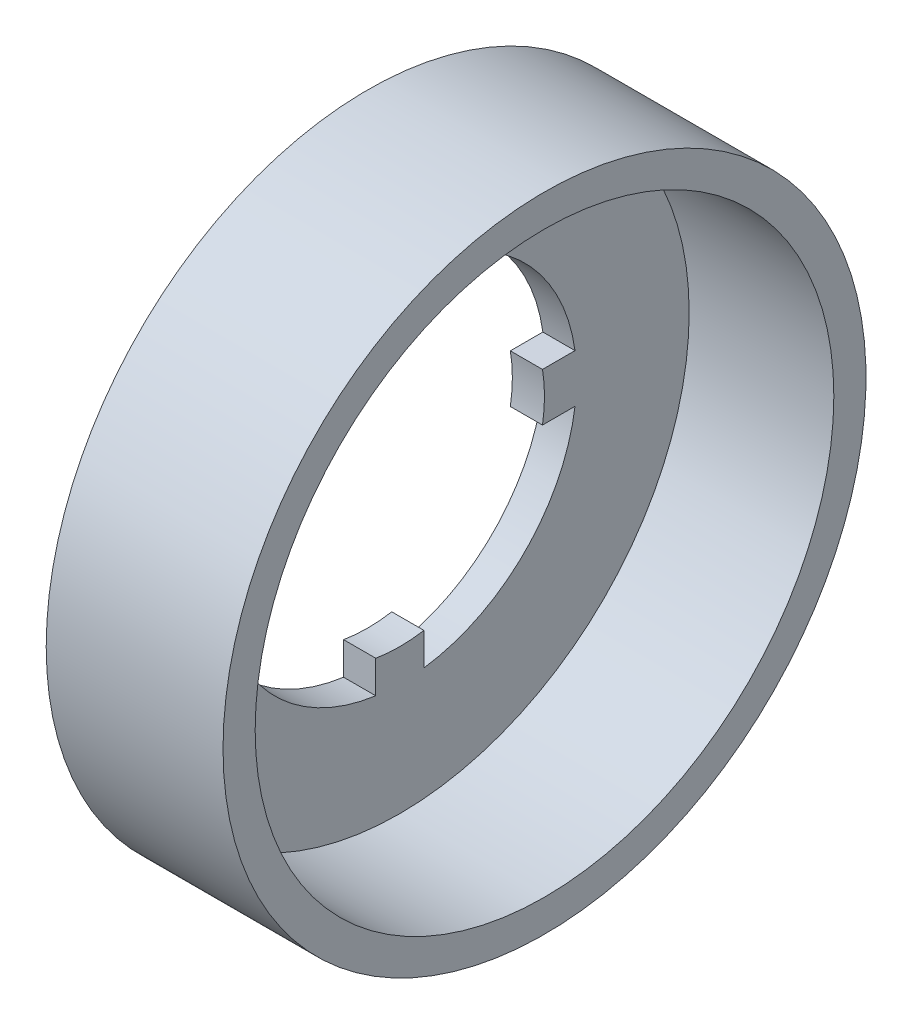
ISO-10303-21;
HEADER;
FILE_DESCRIPTION(('STEP AP214'),'2;1');
FILE_NAME('part.step','',(''),(''),'','','');
FILE_SCHEMA(('AUTOMOTIVE_DESIGN { 1 0 10303 214 1 1 1 1 }'));
ENDSEC;
DATA;
#1=APPLICATION_CONTEXT('core data for automotive mechanical design processes');
#2=APPLICATION_PROTOCOL_DEFINITION('international standard','automotive_design',2000,#1);
#3=PRODUCT_CONTEXT('',#1,'mechanical');
#4=PRODUCT('Part','Part','',(#3));
#5=PRODUCT_RELATED_PRODUCT_CATEGORY('part','',(#4));
#6=PRODUCT_DEFINITION_FORMATION('','',#4);
#7=PRODUCT_DEFINITION_CONTEXT('part definition',#1,'design');
#8=PRODUCT_DEFINITION('design','',#6,#7);
#9=PRODUCT_DEFINITION_SHAPE('','',#8);
#10=(LENGTH_UNIT() NAMED_UNIT(*) SI_UNIT(.MILLI.,.METRE.));
#11=(NAMED_UNIT(*) PLANE_ANGLE_UNIT() SI_UNIT($,.RADIAN.));
#12=(NAMED_UNIT(*) SI_UNIT($,.STERADIAN.) SOLID_ANGLE_UNIT());
#13=UNCERTAINTY_MEASURE_WITH_UNIT(LENGTH_MEASURE(1.E-05),#10,'distance_accuracy_value','');
#14=(GEOMETRIC_REPRESENTATION_CONTEXT(3) GLOBAL_UNCERTAINTY_ASSIGNED_CONTEXT((#13)) GLOBAL_UNIT_ASSIGNED_CONTEXT((#10,
#11,#12)) REPRESENTATION_CONTEXT('',''));
#15=CARTESIAN_POINT('',(0.,0.,0.));
#16=DIRECTION('',(0.,0.,1.));
#17=DIRECTION('',(1.,0.,0.));
#18=AXIS2_PLACEMENT_3D('',#15,#16,#17);
#19=CARTESIAN_POINT('',(0.,0.,0.));
#20=DIRECTION('',(-1.,0.,0.));
#21=DIRECTION('',(0.,0.,1.));
#22=AXIS2_PLACEMENT_3D('',#19,#20,#21);
#23=CYLINDRICAL_SURFACE('',#22,18.);
#24=CARTESIAN_POINT('',(4.,0.,0.));
#25=DIRECTION('',(-1.,0.,0.));
#26=DIRECTION('',(0.,0.,1.));
#27=AXIS2_PLACEMENT_3D('',#24,#25,#26);
#28=CIRCLE('',#27,18.);
#29=CARTESIAN_POINT('',(4.,17.7482393492988,3.));
#30=VERTEX_POINT('',#29);
#31=CARTESIAN_POINT('',(4.,17.7482393492988,-3.));
#32=VERTEX_POINT('',#31);
#33=EDGE_CURVE('E271',#30,#32,#28,.T.);
#34=ORIENTED_EDGE('',*,*,#33,.F.);
#35=DIRECTION('',(-1.,0.,0.));
#36=VECTOR('',#35,1.);
#37=CARTESIAN_POINT('',(0.,17.7482393492988,3.));
#38=LINE('',#37,#36);
#39=CARTESIAN_POINT('',(0.,17.7482393492988,3.));
#40=VERTEX_POINT('',#39);
#41=EDGE_CURVE('E253',#30,#40,#38,.T.);
#42=ORIENTED_EDGE('',*,*,#41,.T.);
#43=CARTESIAN_POINT('',(0.,0.,0.));
#44=DIRECTION('',(-1.,0.,0.));
#45=DIRECTION('',(0.,0.,1.));
#46=AXIS2_PLACEMENT_3D('',#43,#44,#45);
#47=CIRCLE('',#46,18.);
#48=CARTESIAN_POINT('',(0.,17.7482393492988,-3.));
#49=VERTEX_POINT('',#48);
#50=EDGE_CURVE('E266',#40,#49,#47,.T.);
#51=ORIENTED_EDGE('',*,*,#50,.T.);
#52=DIRECTION('',(-1.,0.,0.));
#53=VECTOR('',#52,1.);
#54=CARTESIAN_POINT('',(0.,17.7482393492988,-3.));
#55=LINE('',#54,#53);
#56=EDGE_CURVE('E167',#49,#32,#55,.F.);
#57=ORIENTED_EDGE('',*,*,#56,.T.);
#58=EDGE_LOOP('',(#34,#42,#51,#57));
#59=FACE_BOUND('',#58,.T.);
#60=ADVANCED_FACE('F34',(#59),#23,.F.);
#61=CARTESIAN_POINT('',(0.,-3.,17.7482393492988));
#62=VERTEX_POINT('',#61);
#63=CARTESIAN_POINT('',(0.,3.00000000000001,17.7482393492988));
#64=VERTEX_POINT('',#63);
#65=EDGE_CURVE('E262',#62,#64,#47,.T.);
#66=ORIENTED_EDGE('',*,*,#65,.T.);
#67=DIRECTION('',(-1.,0.,0.));
#68=VECTOR('',#67,1.);
#69=CARTESIAN_POINT('',(0.,3.,17.7482393492988));
#70=LINE('',#69,#68);
#71=CARTESIAN_POINT('',(4.,3.,17.7482393492988));
#72=VERTEX_POINT('',#71);
#73=EDGE_CURVE('E244',#64,#72,#70,.F.);
#74=ORIENTED_EDGE('',*,*,#73,.T.);
#75=CARTESIAN_POINT('',(4.,-3.,17.7482393492988));
#76=VERTEX_POINT('',#75);
#77=EDGE_CURVE('E267',#76,#72,#28,.T.);
#78=ORIENTED_EDGE('',*,*,#77,.F.);
#79=DIRECTION('',(-1.,0.,0.));
#80=VECTOR('',#79,1.);
#81=CARTESIAN_POINT('',(0.,-3.,17.7482393492988));
#82=LINE('',#81,#80);
#83=EDGE_CURVE('E238',#76,#62,#82,.T.);
#84=ORIENTED_EDGE('',*,*,#83,.T.);
#85=EDGE_LOOP('',(#66,#74,#78,#84));
#86=FACE_BOUND('',#85,.T.);
#87=ADVANCED_FACE('F309',(#86),#23,.F.);
#88=CARTESIAN_POINT('',(0.,-17.7482393492988,-3.));
#89=VERTEX_POINT('',#88);
#90=CARTESIAN_POINT('',(0.,-17.7482393492988,3.));
#91=VERTEX_POINT('',#90);
#92=EDGE_CURVE('E265',#89,#91,#47,.T.);
#93=ORIENTED_EDGE('',*,*,#92,.T.);
#94=DIRECTION('',(-1.,0.,0.));
#95=VECTOR('',#94,1.);
#96=CARTESIAN_POINT('',(0.,-17.7482393492988,3.));
#97=LINE('',#96,#95);
#98=CARTESIAN_POINT('',(4.,-17.7482393492988,3.));
#99=VERTEX_POINT('',#98);
#100=EDGE_CURVE('E49',#91,#99,#97,.F.);
#101=ORIENTED_EDGE('',*,*,#100,.T.);
#102=CARTESIAN_POINT('',(4.,-17.7482393492988,-3.));
#103=VERTEX_POINT('',#102);
#104=EDGE_CURVE('E270',#103,#99,#28,.T.);
#105=ORIENTED_EDGE('',*,*,#104,.F.);
#106=DIRECTION('',(-1.,0.,0.));
#107=VECTOR('',#106,1.);
#108=CARTESIAN_POINT('',(0.,-17.7482393492988,-3.));
#109=LINE('',#108,#107);
#110=EDGE_CURVE('E225',#103,#89,#109,.T.);
#111=ORIENTED_EDGE('',*,*,#110,.T.);
#112=EDGE_LOOP('',(#93,#101,#105,#111));
#113=FACE_BOUND('',#112,.T.);
#114=ADVANCED_FACE('F287',(#113),#23,.F.);
#115=CARTESIAN_POINT('',(0.,0.,0.));
#116=DIRECTION('',(-1.,0.,0.));
#117=DIRECTION('',(0.,0.,1.));
#118=AXIS2_PLACEMENT_3D('',#115,#116,#117);
#119=CYLINDRICAL_SURFACE('',#118,40.);
#120=CARTESIAN_POINT('',(0.,0.,0.));
#121=DIRECTION('',(-1.,0.,0.));
#122=DIRECTION('',(0.,0.,1.));
#123=AXIS2_PLACEMENT_3D('',#120,#121,#122);
#124=CIRCLE('',#123,40.);
#125=CARTESIAN_POINT('',(0.,0.,40.));
#126=VERTEX_POINT('',#125);
#127=EDGE_CURVE('E259',#126,#126,#124,.T.);
#128=ORIENTED_EDGE('',*,*,#127,.F.);
#129=EDGE_LOOP('',(#128));
#130=FACE_BOUND('',#129,.T.);
#131=CARTESIAN_POINT('',(22.,0.,0.));
#132=DIRECTION('',(-1.,0.,0.));
#133=DIRECTION('',(0.,0.,1.));
#134=AXIS2_PLACEMENT_3D('',#131,#132,#133);
#135=CIRCLE('',#134,40.);
#136=CARTESIAN_POINT('',(22.,0.,40.));
#137=VERTEX_POINT('',#136);
#138=EDGE_CURVE('E172',#137,#137,#135,.T.);
#139=ORIENTED_EDGE('',*,*,#138,.T.);
#140=EDGE_LOOP('',(#139));
#141=FACE_BOUND('',#140,.T.);
#142=ADVANCED_FACE('F36',(#130,#141),#119,.T.);
#143=CARTESIAN_POINT('',(22.,36.,0.));
#144=DIRECTION('',(-1.,0.,0.));
#145=DIRECTION('',(0.,0.,1.));
#146=AXIS2_PLACEMENT_3D('',#143,#144,#145);
#147=PLANE('',#146);
#148=ORIENTED_EDGE('',*,*,#138,.F.);
#149=EDGE_LOOP('',(#148));
#150=FACE_BOUND('',#149,.T.);
#151=CARTESIAN_POINT('',(22.,0.,0.));
#152=DIRECTION('',(-1.,0.,0.));
#153=DIRECTION('',(0.,0.,1.));
#154=AXIS2_PLACEMENT_3D('',#151,#152,#153);
#155=CIRCLE('',#154,36.);
#156=CARTESIAN_POINT('',(22.,0.,36.));
#157=VERTEX_POINT('',#156);
#158=EDGE_CURVE('E275',#157,#157,#155,.T.);
#159=ORIENTED_EDGE('',*,*,#158,.T.);
#160=EDGE_LOOP('',(#159));
#161=FACE_BOUND('',#160,.T.);
#162=ADVANCED_FACE('F349',(#150,#161),#147,.F.);
#163=CARTESIAN_POINT('',(0.,0.,0.));
#164=DIRECTION('',(-1.,0.,0.));
#165=DIRECTION('',(0.,0.,1.));
#166=AXIS2_PLACEMENT_3D('',#163,#164,#165);
#167=CYLINDRICAL_SURFACE('',#166,36.);
#168=ORIENTED_EDGE('',*,*,#158,.F.);
#169=EDGE_LOOP('',(#168));
#170=FACE_BOUND('',#169,.T.);
#171=CARTESIAN_POINT('',(4.,0.,0.));
#172=DIRECTION('',(-1.,0.,0.));
#173=DIRECTION('',(0.,0.,1.));
#174=AXIS2_PLACEMENT_3D('',#171,#172,#173);
#175=CIRCLE('',#174,36.);
#176=CARTESIAN_POINT('',(4.,0.,36.));
#177=VERTEX_POINT('',#176);
#178=EDGE_CURVE('E272',#177,#177,#175,.T.);
#179=ORIENTED_EDGE('',*,*,#178,.T.);
#180=EDGE_LOOP('',(#179));
#181=FACE_BOUND('',#180,.T.);
#182=ADVANCED_FACE('F343',(#170,#181),#167,.F.);
#183=CARTESIAN_POINT('',(4.,18.,0.));
#184=DIRECTION('',(-1.,0.,0.));
#185=DIRECTION('',(0.,0.,1.));
#186=AXIS2_PLACEMENT_3D('',#183,#184,#185);
#187=PLANE('',#186);
#188=ORIENTED_EDGE('',*,*,#178,.F.);
#189=EDGE_LOOP('',(#188));
#190=FACE_BOUND('',#189,.T.);
#191=CARTESIAN_POINT('',(4.,0.,0.));
#192=DIRECTION('',(-1.,0.,0.));
#193=DIRECTION('',(0.,0.,1.));
#194=AXIS2_PLACEMENT_3D('',#191,#192,#193);
#195=CIRCLE('',#194,22.);
#196=CARTESIAN_POINT('',(4.,3.,21.7944947177034));
#197=VERTEX_POINT('',#196);
#198=CARTESIAN_POINT('',(4.,21.7944947177034,3.));
#199=VERTEX_POINT('',#198);
#200=EDGE_CURVE('E250',#197,#199,#195,.T.);
#201=ORIENTED_EDGE('',*,*,#200,.T.);
#202=DIRECTION('',(0.,-1.,0.));
#203=VECTOR('',#202,1.);
#204=CARTESIAN_POINT('',(4.,18.,3.));
#205=LINE('',#204,#203);
#206=EDGE_CURVE('E256',#199,#30,#205,.T.);
#207=ORIENTED_EDGE('',*,*,#206,.T.);
#208=ORIENTED_EDGE('',*,*,#33,.T.);
#209=DIRECTION('',(0.,1.,0.));
#210=VECTOR('',#209,1.);
#211=CARTESIAN_POINT('',(4.,18.,-3.));
#212=LINE('',#211,#210);
#213=CARTESIAN_POINT('',(4.,21.7944947177034,-3.));
#214=VERTEX_POINT('',#213);
#215=EDGE_CURVE('E209',#32,#214,#212,.T.);
#216=ORIENTED_EDGE('',*,*,#215,.T.);
#217=CARTESIAN_POINT('',(4.,0.,0.));
#218=DIRECTION('',(-1.,0.,0.));
#219=DIRECTION('',(0.,0.,1.));
#220=AXIS2_PLACEMENT_3D('',#217,#218,#219);
#221=CIRCLE('',#220,22.);
#222=CARTESIAN_POINT('',(4.,3.,-21.7944947177034));
#223=VERTEX_POINT('',#222);
#224=EDGE_CURVE('E157',#214,#223,#221,.T.);
#225=ORIENTED_EDGE('',*,*,#224,.T.);
#226=DIRECTION('',(0.,0.,1.));
#227=VECTOR('',#226,1.);
#228=CARTESIAN_POINT('',(4.,3.00000000000001,0.));
#229=LINE('',#228,#227);
#230=CARTESIAN_POINT('',(4.,3.,-17.7482393492988));
#231=VERTEX_POINT('',#230);
#232=EDGE_CURVE('E215',#223,#231,#229,.T.);
#233=ORIENTED_EDGE('',*,*,#232,.T.);
#234=CARTESIAN_POINT('',(4.,-3.00000000000001,-17.7482393492988));
#235=VERTEX_POINT('',#234);
#236=EDGE_CURVE('E486',#231,#235,#28,.T.);
#237=ORIENTED_EDGE('',*,*,#236,.T.);
#238=DIRECTION('',(0.,0.,-1.));
#239=VECTOR('',#238,1.);
#240=CARTESIAN_POINT('',(4.,-3.,0.));
#241=LINE('',#240,#239);
#242=CARTESIAN_POINT('',(4.,-3.00000000000001,-21.7944947177034));
#243=VERTEX_POINT('',#242);
#244=EDGE_CURVE('E219',#235,#243,#241,.T.);
#245=ORIENTED_EDGE('',*,*,#244,.T.);
#246=CARTESIAN_POINT('',(4.,0.,0.));
#247=DIRECTION('',(-1.,0.,0.));
#248=DIRECTION('',(0.,0.,1.));
#249=AXIS2_PLACEMENT_3D('',#246,#247,#248);
#250=CIRCLE('',#249,22.);
#251=CARTESIAN_POINT('',(4.,-21.7944947177034,-3.));
#252=VERTEX_POINT('',#251);
#253=EDGE_CURVE('E222',#243,#252,#250,.T.);
#254=ORIENTED_EDGE('',*,*,#253,.T.);
#255=DIRECTION('',(0.,1.,0.));
#256=VECTOR('',#255,1.);
#257=CARTESIAN_POINT('',(4.,18.,-3.00000000000001));
#258=LINE('',#257,#256);
#259=EDGE_CURVE('E228',#252,#103,#258,.T.);
#260=ORIENTED_EDGE('',*,*,#259,.T.);
#261=ORIENTED_EDGE('',*,*,#104,.T.);
#262=DIRECTION('',(0.,-1.,0.));
#263=VECTOR('',#262,1.);
#264=CARTESIAN_POINT('',(4.,18.,2.99999999999999));
#265=LINE('',#264,#263);
#266=CARTESIAN_POINT('',(4.,-21.7944947177034,3.00000000000001));
#267=VERTEX_POINT('',#266);
#268=EDGE_CURVE('E232',#99,#267,#265,.T.);
#269=ORIENTED_EDGE('',*,*,#268,.T.);
#270=CARTESIAN_POINT('',(4.,0.,0.));
#271=DIRECTION('',(-1.,0.,0.));
#272=DIRECTION('',(0.,0.,1.));
#273=AXIS2_PLACEMENT_3D('',#270,#271,#272);
#274=CIRCLE('',#273,22.);
#275=CARTESIAN_POINT('',(4.,-3.,21.7944947177034));
#276=VERTEX_POINT('',#275);
#277=EDGE_CURVE('E235',#267,#276,#274,.T.);
#278=ORIENTED_EDGE('',*,*,#277,.T.);
#279=DIRECTION('',(0.,0.,-1.));
#280=VECTOR('',#279,1.);
#281=CARTESIAN_POINT('',(4.,-3.00000000000001,0.));
#282=LINE('',#281,#280);
#283=EDGE_CURVE('E241',#276,#76,#282,.T.);
#284=ORIENTED_EDGE('',*,*,#283,.T.);
#285=ORIENTED_EDGE('',*,*,#77,.T.);
#286=DIRECTION('',(0.,0.,1.));
#287=VECTOR('',#286,1.);
#288=CARTESIAN_POINT('',(4.,3.,0.));
#289=LINE('',#288,#287);
#290=EDGE_CURVE('E247',#72,#197,#289,.T.);
#291=ORIENTED_EDGE('',*,*,#290,.T.);
#292=EDGE_LOOP('',(#201,#207,#208,#216,#225,#233,#237,#245,#254,#260,#261,#269,#278,#284,#285,#291));
#293=FACE_BOUND('',#292,.T.);
#294=ADVANCED_FACE('F315',(#190,#293),#187,.F.);
#295=CARTESIAN_POINT('',(0.,3.,-17.7482393492988));
#296=VERTEX_POINT('',#295);
#297=CARTESIAN_POINT('',(0.,-3.,-17.7482393492988));
#298=VERTEX_POINT('',#297);
#299=EDGE_CURVE('E290',#296,#298,#47,.T.);
#300=ORIENTED_EDGE('',*,*,#299,.T.);
#301=DIRECTION('',(-1.,0.,0.));
#302=VECTOR('',#301,1.);
#303=CARTESIAN_POINT('',(0.,-3.00000000000001,-17.7482393492988));
#304=LINE('',#303,#302);
#305=EDGE_CURVE('E57',#298,#235,#304,.F.);
#306=ORIENTED_EDGE('',*,*,#305,.T.);
#307=ORIENTED_EDGE('',*,*,#236,.F.);
#308=DIRECTION('',(-1.,0.,0.));
#309=VECTOR('',#308,1.);
#310=CARTESIAN_POINT('',(0.,3.,-17.7482393492988));
#311=LINE('',#310,#309);
#312=EDGE_CURVE('E212',#231,#296,#311,.T.);
#313=ORIENTED_EDGE('',*,*,#312,.T.);
#314=EDGE_LOOP('',(#300,#306,#307,#313));
#315=FACE_BOUND('',#314,.T.);
#316=ADVANCED_FACE('F332',(#315),#23,.F.);
#317=CARTESIAN_POINT('',(0.,40.,0.));
#318=DIRECTION('',(1.,0.,0.));
#319=DIRECTION('',(0.,0.,-1.));
#320=AXIS2_PLACEMENT_3D('',#317,#318,#319);
#321=PLANE('',#320);
#322=ORIENTED_EDGE('',*,*,#50,.F.);
#323=DIRECTION('',(0.,-1.,0.));
#324=VECTOR('',#323,1.);
#325=CARTESIAN_POINT('',(0.,16.,3.));
#326=LINE('',#325,#324);
#327=CARTESIAN_POINT('',(0.,21.7944947177034,3.));
#328=VERTEX_POINT('',#327);
#329=EDGE_CURVE('E161',#328,#40,#326,.T.);
#330=ORIENTED_EDGE('',*,*,#329,.F.);
#331=CARTESIAN_POINT('',(0.,0.,0.));
#332=DIRECTION('',(-1.,0.,0.));
#333=DIRECTION('',(0.,0.,1.));
#334=AXIS2_PLACEMENT_3D('',#331,#332,#333);
#335=CIRCLE('',#334,22.);
#336=CARTESIAN_POINT('',(0.,3.,21.7944947177034));
#337=VERTEX_POINT('',#336);
#338=EDGE_CURVE('E191',#337,#328,#335,.T.);
#339=ORIENTED_EDGE('',*,*,#338,.F.);
#340=DIRECTION('',(0.,0.,-1.));
#341=VECTOR('',#340,1.);
#342=CARTESIAN_POINT('',(0.,3.,0.));
#343=LINE('',#342,#341);
#344=EDGE_CURVE('E11',#337,#64,#343,.T.);
#345=ORIENTED_EDGE('',*,*,#344,.T.);
#346=ORIENTED_EDGE('',*,*,#65,.F.);
#347=DIRECTION('',(0.,0.,-1.));
#348=VECTOR('',#347,1.);
#349=CARTESIAN_POINT('',(0.,-3.,16.));
#350=LINE('',#349,#348);
#351=CARTESIAN_POINT('',(0.,-3.,21.7944947177034));
#352=VERTEX_POINT('',#351);
#353=EDGE_CURVE('E189',#352,#62,#350,.T.);
#354=ORIENTED_EDGE('',*,*,#353,.F.);
#355=CARTESIAN_POINT('',(0.,0.,0.));
#356=DIRECTION('',(-1.,0.,0.));
#357=DIRECTION('',(0.,0.,1.));
#358=AXIS2_PLACEMENT_3D('',#355,#356,#357);
#359=CIRCLE('',#358,22.);
#360=CARTESIAN_POINT('',(0.,-21.7944947177034,3.00000000000001));
#361=VERTEX_POINT('',#360);
#362=EDGE_CURVE('E186',#361,#352,#359,.T.);
#363=ORIENTED_EDGE('',*,*,#362,.F.);
#364=DIRECTION('',(0.,1.,0.));
#365=VECTOR('',#364,1.);
#366=CARTESIAN_POINT('',(0.,40.,2.99999999999999));
#367=LINE('',#366,#365);
#368=EDGE_CURVE('E42',#361,#91,#367,.T.);
#369=ORIENTED_EDGE('',*,*,#368,.T.);
#370=ORIENTED_EDGE('',*,*,#92,.F.);
#371=DIRECTION('',(0.,1.,0.));
#372=VECTOR('',#371,1.);
#373=CARTESIAN_POINT('',(0.,-16.,-3.));
#374=LINE('',#373,#372);
#375=CARTESIAN_POINT('',(0.,-21.7944947177034,-3.));
#376=VERTEX_POINT('',#375);
#377=EDGE_CURVE('E184',#376,#89,#374,.T.);
#378=ORIENTED_EDGE('',*,*,#377,.F.);
#379=CARTESIAN_POINT('',(0.,0.,0.));
#380=DIRECTION('',(-1.,0.,0.));
#381=DIRECTION('',(0.,0.,1.));
#382=AXIS2_PLACEMENT_3D('',#379,#380,#381);
#383=CIRCLE('',#382,22.);
#384=CARTESIAN_POINT('',(0.,-3.00000000000001,-21.7944947177034));
#385=VERTEX_POINT('',#384);
#386=EDGE_CURVE('E179',#385,#376,#383,.T.);
#387=ORIENTED_EDGE('',*,*,#386,.F.);
#388=DIRECTION('',(0.,0.,1.));
#389=VECTOR('',#388,1.);
#390=CARTESIAN_POINT('',(0.,-3.,0.));
#391=LINE('',#390,#389);
#392=EDGE_CURVE('E171',#385,#298,#391,.T.);
#393=ORIENTED_EDGE('',*,*,#392,.T.);
#394=ORIENTED_EDGE('',*,*,#299,.F.);
#395=DIRECTION('',(0.,0.,1.));
#396=VECTOR('',#395,1.);
#397=CARTESIAN_POINT('',(0.,3.,-16.));
#398=LINE('',#397,#396);
#399=CARTESIAN_POINT('',(0.,3.,-21.7944947177034));
#400=VERTEX_POINT('',#399);
#401=EDGE_CURVE('E177',#400,#296,#398,.T.);
#402=ORIENTED_EDGE('',*,*,#401,.F.);
#403=CARTESIAN_POINT('',(0.,0.,0.));
#404=DIRECTION('',(-1.,0.,0.));
#405=DIRECTION('',(0.,0.,1.));
#406=AXIS2_PLACEMENT_3D('',#403,#404,#405);
#407=CIRCLE('',#406,22.);
#408=CARTESIAN_POINT('',(0.,21.7944947177034,-3.));
#409=VERTEX_POINT('',#408);
#410=EDGE_CURVE('E154',#409,#400,#407,.T.);
#411=ORIENTED_EDGE('',*,*,#410,.F.);
#412=DIRECTION('',(0.,-1.,0.));
#413=VECTOR('',#412,1.);
#414=CARTESIAN_POINT('',(0.,40.,-3.));
#415=LINE('',#414,#413);
#416=EDGE_CURVE('E164',#409,#49,#415,.T.);
#417=ORIENTED_EDGE('',*,*,#416,.T.);
#418=EDGE_LOOP('',(#322,#330,#339,#345,#346,#354,#363,#369,#370,#378,#387,#393,#394,#402,#411,#417));
#419=FACE_BOUND('',#418,.T.);
#420=ORIENTED_EDGE('',*,*,#127,.T.);
#421=EDGE_LOOP('',(#420));
#422=FACE_BOUND('',#421,.T.);
#423=ADVANCED_FACE('F174',(#419,#422),#321,.F.);
#424=CARTESIAN_POINT('',(22.,16.,-3.));
#425=DIRECTION('',(0.,0.,1.));
#426=DIRECTION('',(1.,0.,0.));
#427=AXIS2_PLACEMENT_3D('',#424,#425,#426);
#428=PLANE('',#427);
#429=ORIENTED_EDGE('',*,*,#56,.F.);
#430=ORIENTED_EDGE('',*,*,#416,.F.);
#431=DIRECTION('',(-1.,0.,0.));
#432=VECTOR('',#431,1.);
#433=CARTESIAN_POINT('',(22.,21.7944947177034,-3.));
#434=LINE('',#433,#432);
#435=EDGE_CURVE('E149',#214,#409,#434,.T.);
#436=ORIENTED_EDGE('',*,*,#435,.F.);
#437=ORIENTED_EDGE('',*,*,#215,.F.);
#438=EDGE_LOOP('',(#429,#430,#436,#437));
#439=FACE_BOUND('',#438,.T.);
#440=ADVANCED_FACE('F165',(#439),#428,.F.);
#441=CARTESIAN_POINT('',(22.,0.,0.));
#442=DIRECTION('',(-1.,0.,0.));
#443=DIRECTION('',(0.,0.,1.));
#444=AXIS2_PLACEMENT_3D('',#441,#442,#443);
#445=CYLINDRICAL_SURFACE('',#444,22.);
#446=ORIENTED_EDGE('',*,*,#435,.T.);
#447=ORIENTED_EDGE('',*,*,#410,.T.);
#448=DIRECTION('',(-1.,0.,0.));
#449=VECTOR('',#448,1.);
#450=CARTESIAN_POINT('',(22.,3.,-21.7944947177034));
#451=LINE('',#450,#449);
#452=EDGE_CURVE('E160',#223,#400,#451,.T.);
#453=ORIENTED_EDGE('',*,*,#452,.F.);
#454=ORIENTED_EDGE('',*,*,#224,.F.);
#455=EDGE_LOOP('',(#446,#447,#453,#454));
#456=FACE_BOUND('',#455,.T.);
#457=ADVANCED_FACE('F151',(#456),#445,.F.);
#458=CARTESIAN_POINT('',(22.,3.,-16.));
#459=DIRECTION('',(0.,-1.,0.));
#460=DIRECTION('',(0.,0.,-1.));
#461=AXIS2_PLACEMENT_3D('',#458,#459,#460);
#462=PLANE('',#461);
#463=ORIENTED_EDGE('',*,*,#452,.T.);
#464=ORIENTED_EDGE('',*,*,#401,.T.);
#465=ORIENTED_EDGE('',*,*,#312,.F.);
#466=ORIENTED_EDGE('',*,*,#232,.F.);
#467=EDGE_LOOP('',(#463,#464,#465,#466));
#468=FACE_BOUND('',#467,.T.);
#469=ADVANCED_FACE('F402',(#468),#462,.F.);
#470=CARTESIAN_POINT('',(22.,-3.00000000000001,-16.));
#471=DIRECTION('',(0.,1.,0.));
#472=DIRECTION('',(0.,0.,1.));
#473=AXIS2_PLACEMENT_3D('',#470,#471,#472);
#474=PLANE('',#473);
#475=ORIENTED_EDGE('',*,*,#305,.F.);
#476=ORIENTED_EDGE('',*,*,#392,.F.);
#477=DIRECTION('',(-1.,0.,0.));
#478=VECTOR('',#477,1.);
#479=CARTESIAN_POINT('',(22.,-3.00000000000001,-21.7944947177034));
#480=LINE('',#479,#478);
#481=EDGE_CURVE('E205',#243,#385,#480,.T.);
#482=ORIENTED_EDGE('',*,*,#481,.F.);
#483=ORIENTED_EDGE('',*,*,#244,.F.);
#484=EDGE_LOOP('',(#475,#476,#482,#483));
#485=FACE_BOUND('',#484,.T.);
#486=ADVANCED_FACE('F411',(#485),#474,.F.);
#487=CARTESIAN_POINT('',(22.,0.,0.));
#488=DIRECTION('',(-1.,0.,0.));
#489=DIRECTION('',(0.,0.,1.));
#490=AXIS2_PLACEMENT_3D('',#487,#488,#489);
#491=CYLINDRICAL_SURFACE('',#490,22.);
#492=ORIENTED_EDGE('',*,*,#481,.T.);
#493=ORIENTED_EDGE('',*,*,#386,.T.);
#494=DIRECTION('',(-1.,0.,0.));
#495=VECTOR('',#494,1.);
#496=CARTESIAN_POINT('',(22.,-21.7944947177034,-3.));
#497=LINE('',#496,#495);
#498=EDGE_CURVE('E203',#252,#376,#497,.T.);
#499=ORIENTED_EDGE('',*,*,#498,.F.);
#500=ORIENTED_EDGE('',*,*,#253,.F.);
#501=EDGE_LOOP('',(#492,#493,#499,#500));
#502=FACE_BOUND('',#501,.T.);
#503=ADVANCED_FACE('F327',(#502),#491,.F.);
#504=CARTESIAN_POINT('',(22.,-16.,-3.));
#505=DIRECTION('',(0.,0.,1.));
#506=DIRECTION('',(0.,-1.,0.));
#507=AXIS2_PLACEMENT_3D('',#504,#505,#506);
#508=PLANE('',#507);
#509=ORIENTED_EDGE('',*,*,#498,.T.);
#510=ORIENTED_EDGE('',*,*,#377,.T.);
#511=ORIENTED_EDGE('',*,*,#110,.F.);
#512=ORIENTED_EDGE('',*,*,#259,.F.);
#513=EDGE_LOOP('',(#509,#510,#511,#512));
#514=FACE_BOUND('',#513,.T.);
#515=ADVANCED_FACE('F320',(#514),#508,.F.);
#516=CARTESIAN_POINT('',(22.,-16.,3.));
#517=DIRECTION('',(0.,0.,-1.));
#518=DIRECTION('',(0.,1.,0.));
#519=AXIS2_PLACEMENT_3D('',#516,#517,#518);
#520=PLANE('',#519);
#521=ORIENTED_EDGE('',*,*,#100,.F.);
#522=ORIENTED_EDGE('',*,*,#368,.F.);
#523=DIRECTION('',(-1.,0.,0.));
#524=VECTOR('',#523,1.);
#525=CARTESIAN_POINT('',(22.,-21.7944947177034,3.00000000000001));
#526=LINE('',#525,#524);
#527=EDGE_CURVE('E201',#267,#361,#526,.T.);
#528=ORIENTED_EDGE('',*,*,#527,.F.);
#529=ORIENTED_EDGE('',*,*,#268,.F.);
#530=EDGE_LOOP('',(#521,#522,#528,#529));
#531=FACE_BOUND('',#530,.T.);
#532=ADVANCED_FACE('F318',(#531),#520,.F.);
#533=CARTESIAN_POINT('',(22.,0.,0.));
#534=DIRECTION('',(-1.,0.,0.));
#535=DIRECTION('',(0.,0.,1.));
#536=AXIS2_PLACEMENT_3D('',#533,#534,#535);
#537=CYLINDRICAL_SURFACE('',#536,22.);
#538=ORIENTED_EDGE('',*,*,#527,.T.);
#539=ORIENTED_EDGE('',*,*,#362,.T.);
#540=DIRECTION('',(-1.,0.,0.));
#541=VECTOR('',#540,1.);
#542=CARTESIAN_POINT('',(22.,-3.,21.7944947177034));
#543=LINE('',#542,#541);
#544=EDGE_CURVE('E199',#276,#352,#543,.T.);
#545=ORIENTED_EDGE('',*,*,#544,.F.);
#546=ORIENTED_EDGE('',*,*,#277,.F.);
#547=EDGE_LOOP('',(#538,#539,#545,#546));
#548=FACE_BOUND('',#547,.T.);
#549=ADVANCED_FACE('F317',(#548),#537,.F.);
#550=CARTESIAN_POINT('',(22.,-3.,16.));
#551=DIRECTION('',(0.,1.,0.));
#552=DIRECTION('',(0.,0.,1.));
#553=AXIS2_PLACEMENT_3D('',#550,#551,#552);
#554=PLANE('',#553);
#555=ORIENTED_EDGE('',*,*,#544,.T.);
#556=ORIENTED_EDGE('',*,*,#353,.T.);
#557=ORIENTED_EDGE('',*,*,#83,.F.);
#558=ORIENTED_EDGE('',*,*,#283,.F.);
#559=EDGE_LOOP('',(#555,#556,#557,#558));
#560=FACE_BOUND('',#559,.T.);
#561=ADVANCED_FACE('F312',(#560),#554,.F.);
#562=CARTESIAN_POINT('',(22.,16.,3.));
#563=DIRECTION('',(0.,0.,-1.));
#564=DIRECTION('',(-1.,0.,0.));
#565=AXIS2_PLACEMENT_3D('',#562,#563,#564);
#566=PLANE('',#565);
#567=DIRECTION('',(-1.,0.,0.));
#568=VECTOR('',#567,1.);
#569=CARTESIAN_POINT('',(22.,21.7944947177034,3.));
#570=LINE('',#569,#568);
#571=EDGE_CURVE('E195',#199,#328,#570,.T.);
#572=ORIENTED_EDGE('',*,*,#571,.T.);
#573=ORIENTED_EDGE('',*,*,#329,.T.);
#574=ORIENTED_EDGE('',*,*,#41,.F.);
#575=ORIENTED_EDGE('',*,*,#206,.F.);
#576=EDGE_LOOP('',(#572,#573,#574,#575));
#577=FACE_BOUND('',#576,.T.);
#578=ADVANCED_FACE('F299',(#577),#566,.F.);
#579=CARTESIAN_POINT('',(22.,0.,0.));
#580=DIRECTION('',(-1.,0.,0.));
#581=DIRECTION('',(0.,0.,1.));
#582=AXIS2_PLACEMENT_3D('',#579,#580,#581);
#583=CYLINDRICAL_SURFACE('',#582,22.);
#584=DIRECTION('',(-1.,0.,0.));
#585=VECTOR('',#584,1.);
#586=CARTESIAN_POINT('',(22.,3.,21.7944947177034));
#587=LINE('',#586,#585);
#588=EDGE_CURVE('E197',#197,#337,#587,.T.);
#589=ORIENTED_EDGE('',*,*,#588,.T.);
#590=ORIENTED_EDGE('',*,*,#338,.T.);
#591=ORIENTED_EDGE('',*,*,#571,.F.);
#592=ORIENTED_EDGE('',*,*,#200,.F.);
#593=EDGE_LOOP('',(#589,#590,#591,#592));
#594=FACE_BOUND('',#593,.T.);
#595=ADVANCED_FACE('F302',(#594),#583,.F.);
#596=CARTESIAN_POINT('',(22.,3.,16.));
#597=DIRECTION('',(0.,-1.,0.));
#598=DIRECTION('',(0.,0.,-1.));
#599=AXIS2_PLACEMENT_3D('',#596,#597,#598);
#600=PLANE('',#599);
#601=ORIENTED_EDGE('',*,*,#73,.F.);
#602=ORIENTED_EDGE('',*,*,#344,.F.);
#603=ORIENTED_EDGE('',*,*,#588,.F.);
#604=ORIENTED_EDGE('',*,*,#290,.F.);
#605=EDGE_LOOP('',(#601,#602,#603,#604));
#606=FACE_BOUND('',#605,.T.);
#607=ADVANCED_FACE('F306',(#606),#600,.F.);
#608=CLOSED_SHELL('',(#60,#87,#114,#142,#162,#182,#294,#316,#423,#440,#457,#469,#486,#503,#515,
#532,#549,#561,#578,#595,#607));
#609=MANIFOLD_SOLID_BREP('B2',#608);
#610=ADVANCED_BREP_SHAPE_REPRESENTATION('',(#18,#609),#14);
#611=SHAPE_DEFINITION_REPRESENTATION(#9,#610);
ENDSEC;
END-ISO-10303-21;
